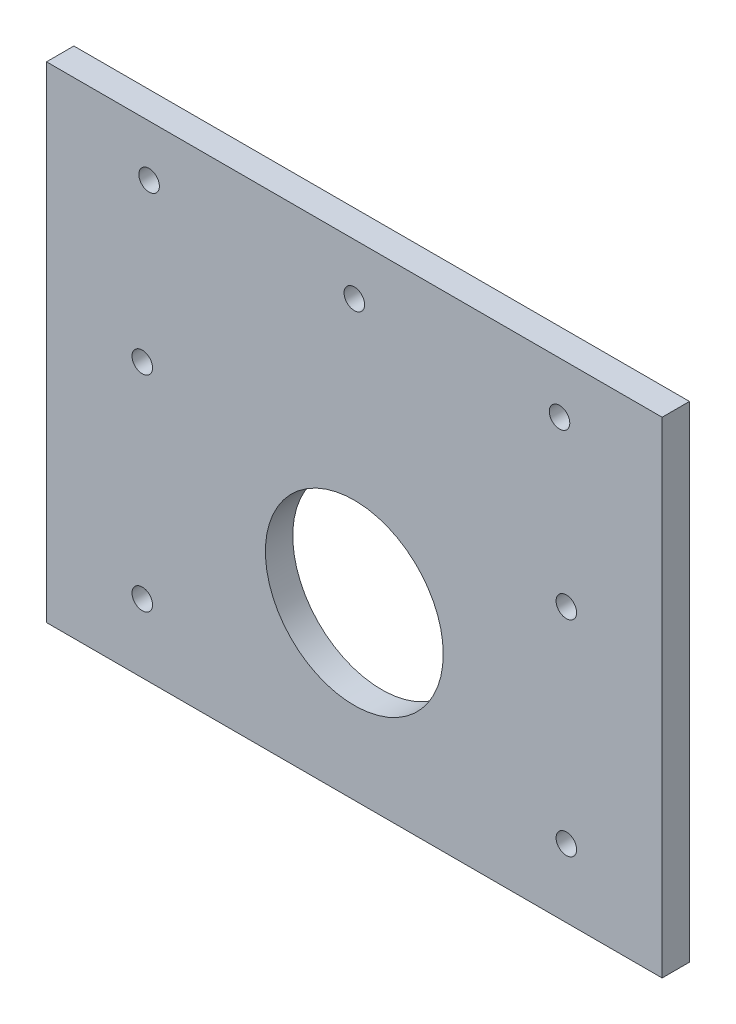
ISO-10303-21;
HEADER;
FILE_DESCRIPTION(('STEP AP214'),'2;1');
FILE_NAME('part.step','',(''),(''),'','','');
FILE_SCHEMA(('AUTOMOTIVE_DESIGN { 1 0 10303 214 1 1 1 1 }'));
ENDSEC;
DATA;
#1=APPLICATION_CONTEXT('core data for automotive mechanical design processes');
#2=APPLICATION_PROTOCOL_DEFINITION('international standard','automotive_design',2000,#1);
#3=PRODUCT_CONTEXT('',#1,'mechanical');
#4=PRODUCT('Part','Part','',(#3));
#5=PRODUCT_RELATED_PRODUCT_CATEGORY('part','',(#4));
#6=PRODUCT_DEFINITION_FORMATION('','',#4);
#7=PRODUCT_DEFINITION_CONTEXT('part definition',#1,'design');
#8=PRODUCT_DEFINITION('design','',#6,#7);
#9=PRODUCT_DEFINITION_SHAPE('','',#8);
#10=(LENGTH_UNIT() NAMED_UNIT(*) SI_UNIT(.MILLI.,.METRE.));
#11=(NAMED_UNIT(*) PLANE_ANGLE_UNIT() SI_UNIT($,.RADIAN.));
#12=(NAMED_UNIT(*) SI_UNIT($,.STERADIAN.) SOLID_ANGLE_UNIT());
#13=UNCERTAINTY_MEASURE_WITH_UNIT(LENGTH_MEASURE(1.E-05),#10,'distance_accuracy_value','');
#14=(GEOMETRIC_REPRESENTATION_CONTEXT(3) GLOBAL_UNCERTAINTY_ASSIGNED_CONTEXT((#13)) GLOBAL_UNIT_ASSIGNED_CONTEXT((#10,
#11,#12)) REPRESENTATION_CONTEXT('',''));
#15=CARTESIAN_POINT('',(0.,0.,0.));
#16=DIRECTION('',(0.,0.,1.));
#17=DIRECTION('',(1.,0.,0.));
#18=AXIS2_PLACEMENT_3D('',#15,#16,#17);
#19=CARTESIAN_POINT('',(45.,35.5,4.));
#20=DIRECTION('',(-1.,0.,0.));
#21=DIRECTION('',(0.,0.,1.));
#22=AXIS2_PLACEMENT_3D('',#19,#20,#21);
#23=PLANE('',#22);
#24=DIRECTION('',(0.,1.,0.));
#25=VECTOR('',#24,1.);
#26=CARTESIAN_POINT('',(45.,35.5,0.));
#27=LINE('',#26,#25);
#28=CARTESIAN_POINT('',(45.,-35.5,0.));
#29=VERTEX_POINT('',#28);
#30=CARTESIAN_POINT('',(45.,35.5,0.));
#31=VERTEX_POINT('',#30);
#32=EDGE_CURVE('E107',#29,#31,#27,.T.);
#33=ORIENTED_EDGE('',*,*,#32,.T.);
#34=DIRECTION('',(0.,0.,-1.));
#35=VECTOR('',#34,1.);
#36=CARTESIAN_POINT('',(45.,35.5,4.));
#37=LINE('',#36,#35);
#38=CARTESIAN_POINT('',(45.,35.5,4.));
#39=VERTEX_POINT('',#38);
#40=EDGE_CURVE('E11',#39,#31,#37,.T.);
#41=ORIENTED_EDGE('',*,*,#40,.F.);
#42=DIRECTION('',(0.,1.,0.));
#43=VECTOR('',#42,1.);
#44=CARTESIAN_POINT('',(45.,35.5,4.));
#45=LINE('',#44,#43);
#46=CARTESIAN_POINT('',(45.,-35.5,4.));
#47=VERTEX_POINT('',#46);
#48=EDGE_CURVE('E91',#47,#39,#45,.T.);
#49=ORIENTED_EDGE('',*,*,#48,.F.);
#50=DIRECTION('',(0.,0.,-1.));
#51=VECTOR('',#50,1.);
#52=CARTESIAN_POINT('',(45.,-35.5,4.));
#53=LINE('',#52,#51);
#54=EDGE_CURVE('E103',#47,#29,#53,.T.);
#55=ORIENTED_EDGE('',*,*,#54,.T.);
#56=EDGE_LOOP('',(#33,#41,#49,#55));
#57=FACE_BOUND('',#56,.T.);
#58=ADVANCED_FACE('F39',(#57),#23,.F.);
#59=CARTESIAN_POINT('',(-45.,35.5,4.));
#60=DIRECTION('',(0.,-1.,0.));
#61=DIRECTION('',(0.,0.,-1.));
#62=AXIS2_PLACEMENT_3D('',#59,#60,#61);
#63=PLANE('',#62);
#64=DIRECTION('',(-1.,0.,0.));
#65=VECTOR('',#64,1.);
#66=CARTESIAN_POINT('',(-45.,35.5,0.));
#67=LINE('',#66,#65);
#68=CARTESIAN_POINT('',(-45.,35.5,0.));
#69=VERTEX_POINT('',#68);
#70=EDGE_CURVE('E96',#31,#69,#67,.T.);
#71=ORIENTED_EDGE('',*,*,#70,.T.);
#72=DIRECTION('',(0.,0.,-1.));
#73=VECTOR('',#72,1.);
#74=CARTESIAN_POINT('',(-45.,35.5,4.));
#75=LINE('',#74,#73);
#76=CARTESIAN_POINT('',(-45.,35.5,4.));
#77=VERTEX_POINT('',#76);
#78=EDGE_CURVE('E48',#77,#69,#75,.T.);
#79=ORIENTED_EDGE('',*,*,#78,.F.);
#80=DIRECTION('',(-1.,0.,0.));
#81=VECTOR('',#80,1.);
#82=CARTESIAN_POINT('',(-45.,35.5,4.));
#83=LINE('',#82,#81);
#84=EDGE_CURVE('E86',#39,#77,#83,.T.);
#85=ORIENTED_EDGE('',*,*,#84,.F.);
#86=ORIENTED_EDGE('',*,*,#40,.T.);
#87=EDGE_LOOP('',(#71,#79,#85,#86));
#88=FACE_BOUND('',#87,.T.);
#89=ADVANCED_FACE('F95',(#88),#63,.F.);
#90=CARTESIAN_POINT('',(-45.,35.5,4.));
#91=DIRECTION('',(1.,0.,0.));
#92=DIRECTION('',(0.,1.,0.));
#93=AXIS2_PLACEMENT_3D('',#90,#91,#92);
#94=PLANE('',#93);
#95=DIRECTION('',(0.,-1.,0.));
#96=VECTOR('',#95,1.);
#97=CARTESIAN_POINT('',(-45.,35.5,0.));
#98=LINE('',#97,#96);
#99=CARTESIAN_POINT('',(-45.,-35.5,0.));
#100=VERTEX_POINT('',#99);
#101=EDGE_CURVE('E73',#69,#100,#98,.T.);
#102=ORIENTED_EDGE('',*,*,#101,.T.);
#103=DIRECTION('',(0.,0.,-1.));
#104=VECTOR('',#103,1.);
#105=CARTESIAN_POINT('',(-45.,-35.5,4.));
#106=LINE('',#105,#104);
#107=CARTESIAN_POINT('',(-45.,-35.5,4.));
#108=VERTEX_POINT('',#107);
#109=EDGE_CURVE('E98',#108,#100,#106,.T.);
#110=ORIENTED_EDGE('',*,*,#109,.F.);
#111=DIRECTION('',(0.,-1.,0.));
#112=VECTOR('',#111,1.);
#113=CARTESIAN_POINT('',(-45.,35.5,4.));
#114=LINE('',#113,#112);
#115=EDGE_CURVE('E89',#77,#108,#114,.T.);
#116=ORIENTED_EDGE('',*,*,#115,.F.);
#117=ORIENTED_EDGE('',*,*,#78,.T.);
#118=EDGE_LOOP('',(#102,#110,#116,#117));
#119=FACE_BOUND('',#118,.T.);
#120=ADVANCED_FACE('F99',(#119),#94,.F.);
#121=CARTESIAN_POINT('',(-45.,-35.5,4.));
#122=DIRECTION('',(0.,1.,0.));
#123=DIRECTION('',(0.,0.,1.));
#124=AXIS2_PLACEMENT_3D('',#121,#122,#123);
#125=PLANE('',#124);
#126=DIRECTION('',(1.,0.,0.));
#127=VECTOR('',#126,1.);
#128=CARTESIAN_POINT('',(-45.,-35.5,0.));
#129=LINE('',#128,#127);
#130=EDGE_CURVE('E79',#100,#29,#129,.T.);
#131=ORIENTED_EDGE('',*,*,#130,.T.);
#132=ORIENTED_EDGE('',*,*,#54,.F.);
#133=DIRECTION('',(1.,0.,0.));
#134=VECTOR('',#133,1.);
#135=CARTESIAN_POINT('',(-45.,-35.5,4.));
#136=LINE('',#135,#134);
#137=EDGE_CURVE('E56',#108,#47,#136,.T.);
#138=ORIENTED_EDGE('',*,*,#137,.F.);
#139=ORIENTED_EDGE('',*,*,#109,.T.);
#140=EDGE_LOOP('',(#131,#132,#138,#139));
#141=FACE_BOUND('',#140,.T.);
#142=ADVANCED_FACE('F121',(#141),#125,.F.);
#143=CARTESIAN_POINT('',(0.,0.,4.));
#144=DIRECTION('',(0.,0.,1.));
#145=DIRECTION('',(1.,0.,0.));
#146=AXIS2_PLACEMENT_3D('',#143,#144,#145);
#147=PLANE('',#146);
#148=CARTESIAN_POINT('',(31.,4.50000000000001,4.));
#149=DIRECTION('',(0.,0.,1.));
#150=DIRECTION('',(1.,0.,0.));
#151=AXIS2_PLACEMENT_3D('',#148,#149,#150);
#152=CIRCLE('',#151,1.5);
#153=CARTESIAN_POINT('',(32.5,4.50000000000001,4.));
#154=VERTEX_POINT('',#153);
#155=EDGE_CURVE('E160',#154,#154,#152,.T.);
#156=ORIENTED_EDGE('',*,*,#155,.F.);
#157=EDGE_LOOP('',(#156));
#158=FACE_BOUND('',#157,.T.);
#159=CARTESIAN_POINT('',(31.,-25.5,4.));
#160=DIRECTION('',(0.,0.,1.));
#161=DIRECTION('',(1.,0.,0.));
#162=AXIS2_PLACEMENT_3D('',#159,#160,#161);
#163=CIRCLE('',#162,1.5);
#164=CARTESIAN_POINT('',(32.5,-25.5,4.));
#165=VERTEX_POINT('',#164);
#166=EDGE_CURVE('E168',#165,#165,#163,.T.);
#167=ORIENTED_EDGE('',*,*,#166,.F.);
#168=EDGE_LOOP('',(#167));
#169=FACE_BOUND('',#168,.T.);
#170=CARTESIAN_POINT('',(-31.,-25.5,4.));
#171=DIRECTION('',(0.,0.,1.));
#172=DIRECTION('',(1.,0.,0.));
#173=AXIS2_PLACEMENT_3D('',#170,#171,#172);
#174=CIRCLE('',#173,1.5);
#175=CARTESIAN_POINT('',(-29.5,-25.5,4.));
#176=VERTEX_POINT('',#175);
#177=EDGE_CURVE('E176',#176,#176,#174,.T.);
#178=ORIENTED_EDGE('',*,*,#177,.F.);
#179=EDGE_LOOP('',(#178));
#180=FACE_BOUND('',#179,.T.);
#181=CARTESIAN_POINT('',(-31.,4.50000000000001,4.));
#182=DIRECTION('',(0.,0.,1.));
#183=DIRECTION('',(1.,0.,0.));
#184=AXIS2_PLACEMENT_3D('',#181,#182,#183);
#185=CIRCLE('',#184,1.5);
#186=CARTESIAN_POINT('',(-29.5,4.50000000000001,4.));
#187=VERTEX_POINT('',#186);
#188=EDGE_CURVE('E184',#187,#187,#185,.T.);
#189=ORIENTED_EDGE('',*,*,#188,.F.);
#190=EDGE_LOOP('',(#189));
#191=FACE_BOUND('',#190,.T.);
#192=CARTESIAN_POINT('',(0.,-10.5,4.));
#193=DIRECTION('',(0.,0.,1.));
#194=DIRECTION('',(1.,0.,0.));
#195=AXIS2_PLACEMENT_3D('',#192,#193,#194);
#196=CIRCLE('',#195,13.);
#197=CARTESIAN_POINT('',(13.,-10.5,4.));
#198=VERTEX_POINT('',#197);
#199=EDGE_CURVE('E152',#198,#198,#196,.T.);
#200=ORIENTED_EDGE('',*,*,#199,.F.);
#201=EDGE_LOOP('',(#200));
#202=FACE_BOUND('',#201,.T.);
#203=CARTESIAN_POINT('',(30.,28.,4.));
#204=DIRECTION('',(0.,0.,1.));
#205=DIRECTION('',(-1.,0.,0.));
#206=AXIS2_PLACEMENT_3D('',#203,#204,#205);
#207=CIRCLE('',#206,1.5);
#208=CARTESIAN_POINT('',(28.5,28.,4.));
#209=VERTEX_POINT('',#208);
#210=EDGE_CURVE('E136',#209,#209,#207,.T.);
#211=ORIENTED_EDGE('',*,*,#210,.F.);
#212=EDGE_LOOP('',(#211));
#213=FACE_BOUND('',#212,.T.);
#214=CARTESIAN_POINT('',(-30.,28.,4.));
#215=DIRECTION('',(0.,0.,1.));
#216=DIRECTION('',(1.,0.,0.));
#217=AXIS2_PLACEMENT_3D('',#214,#215,#216);
#218=CIRCLE('',#217,1.5);
#219=CARTESIAN_POINT('',(-28.5,28.,4.));
#220=VERTEX_POINT('',#219);
#221=EDGE_CURVE('E145',#220,#220,#218,.T.);
#222=ORIENTED_EDGE('',*,*,#221,.F.);
#223=EDGE_LOOP('',(#222));
#224=FACE_BOUND('',#223,.T.);
#225=CARTESIAN_POINT('',(0.,28.,4.));
#226=DIRECTION('',(0.,0.,1.));
#227=DIRECTION('',(1.,0.,0.));
#228=AXIS2_PLACEMENT_3D('',#225,#226,#227);
#229=CIRCLE('',#228,1.5);
#230=CARTESIAN_POINT('',(1.5,28.,4.));
#231=VERTEX_POINT('',#230);
#232=EDGE_CURVE('E128',#231,#231,#229,.T.);
#233=ORIENTED_EDGE('',*,*,#232,.F.);
#234=EDGE_LOOP('',(#233));
#235=FACE_BOUND('',#234,.T.);
#236=ORIENTED_EDGE('',*,*,#48,.T.);
#237=ORIENTED_EDGE('',*,*,#84,.T.);
#238=ORIENTED_EDGE('',*,*,#115,.T.);
#239=ORIENTED_EDGE('',*,*,#137,.T.);
#240=EDGE_LOOP('',(#236,#237,#238,#239));
#241=FACE_BOUND('',#240,.T.);
#242=ADVANCED_FACE('F87',(#158,#169,#180,#191,#202,#213,#224,#235,#241),#147,.T.);
#243=CARTESIAN_POINT('',(0.,0.,0.));
#244=DIRECTION('',(0.,0.,1.));
#245=DIRECTION('',(1.,0.,0.));
#246=AXIS2_PLACEMENT_3D('',#243,#244,#245);
#247=PLANE('',#246);
#248=CARTESIAN_POINT('',(31.,4.50000000000001,0.));
#249=DIRECTION('',(0.,0.,1.));
#250=DIRECTION('',(1.,0.,0.));
#251=AXIS2_PLACEMENT_3D('',#248,#249,#250);
#252=CIRCLE('',#251,1.5);
#253=CARTESIAN_POINT('',(32.5,4.50000000000001,0.));
#254=VERTEX_POINT('',#253);
#255=EDGE_CURVE('E164',#254,#254,#252,.T.);
#256=ORIENTED_EDGE('',*,*,#255,.T.);
#257=EDGE_LOOP('',(#256));
#258=FACE_BOUND('',#257,.T.);
#259=CARTESIAN_POINT('',(31.,-25.5,0.));
#260=DIRECTION('',(0.,0.,1.));
#261=DIRECTION('',(1.,0.,0.));
#262=AXIS2_PLACEMENT_3D('',#259,#260,#261);
#263=CIRCLE('',#262,1.5);
#264=CARTESIAN_POINT('',(32.5,-25.5,0.));
#265=VERTEX_POINT('',#264);
#266=EDGE_CURVE('E172',#265,#265,#263,.T.);
#267=ORIENTED_EDGE('',*,*,#266,.T.);
#268=EDGE_LOOP('',(#267));
#269=FACE_BOUND('',#268,.T.);
#270=CARTESIAN_POINT('',(-31.,-25.5,0.));
#271=DIRECTION('',(0.,0.,1.));
#272=DIRECTION('',(1.,0.,0.));
#273=AXIS2_PLACEMENT_3D('',#270,#271,#272);
#274=CIRCLE('',#273,1.5);
#275=CARTESIAN_POINT('',(-29.5,-25.5,0.));
#276=VERTEX_POINT('',#275);
#277=EDGE_CURVE('E180',#276,#276,#274,.T.);
#278=ORIENTED_EDGE('',*,*,#277,.T.);
#279=EDGE_LOOP('',(#278));
#280=FACE_BOUND('',#279,.T.);
#281=CARTESIAN_POINT('',(-31.,4.50000000000001,0.));
#282=DIRECTION('',(0.,0.,1.));
#283=DIRECTION('',(1.,0.,0.));
#284=AXIS2_PLACEMENT_3D('',#281,#282,#283);
#285=CIRCLE('',#284,1.5);
#286=CARTESIAN_POINT('',(-29.5,4.50000000000001,0.));
#287=VERTEX_POINT('',#286);
#288=EDGE_CURVE('E156',#287,#287,#285,.T.);
#289=ORIENTED_EDGE('',*,*,#288,.T.);
#290=EDGE_LOOP('',(#289));
#291=FACE_BOUND('',#290,.T.);
#292=CARTESIAN_POINT('',(0.,-10.5,0.));
#293=DIRECTION('',(0.,0.,1.));
#294=DIRECTION('',(1.,0.,0.));
#295=AXIS2_PLACEMENT_3D('',#292,#293,#294);
#296=CIRCLE('',#295,13.);
#297=CARTESIAN_POINT('',(13.,-10.5,0.));
#298=VERTEX_POINT('',#297);
#299=EDGE_CURVE('E141',#298,#298,#296,.T.);
#300=ORIENTED_EDGE('',*,*,#299,.T.);
#301=EDGE_LOOP('',(#300));
#302=FACE_BOUND('',#301,.T.);
#303=CARTESIAN_POINT('',(30.,28.,0.));
#304=DIRECTION('',(0.,0.,1.));
#305=DIRECTION('',(-1.,0.,0.));
#306=AXIS2_PLACEMENT_3D('',#303,#304,#305);
#307=CIRCLE('',#306,1.5);
#308=CARTESIAN_POINT('',(28.5,28.,0.));
#309=VERTEX_POINT('',#308);
#310=EDGE_CURVE('E140',#309,#309,#307,.T.);
#311=ORIENTED_EDGE('',*,*,#310,.T.);
#312=EDGE_LOOP('',(#311));
#313=FACE_BOUND('',#312,.T.);
#314=CARTESIAN_POINT('',(-30.,28.,0.));
#315=DIRECTION('',(0.,0.,1.));
#316=DIRECTION('',(1.,0.,0.));
#317=AXIS2_PLACEMENT_3D('',#314,#315,#316);
#318=CIRCLE('',#317,1.5);
#319=CARTESIAN_POINT('',(-28.5,28.,0.));
#320=VERTEX_POINT('',#319);
#321=EDGE_CURVE('E132',#320,#320,#318,.T.);
#322=ORIENTED_EDGE('',*,*,#321,.T.);
#323=EDGE_LOOP('',(#322));
#324=FACE_BOUND('',#323,.T.);
#325=CARTESIAN_POINT('',(0.,28.,0.));
#326=DIRECTION('',(0.,0.,1.));
#327=DIRECTION('',(1.,0.,0.));
#328=AXIS2_PLACEMENT_3D('',#325,#326,#327);
#329=CIRCLE('',#328,1.5);
#330=CARTESIAN_POINT('',(1.5,28.,0.));
#331=VERTEX_POINT('',#330);
#332=EDGE_CURVE('E111',#331,#331,#329,.T.);
#333=ORIENTED_EDGE('',*,*,#332,.T.);
#334=EDGE_LOOP('',(#333));
#335=FACE_BOUND('',#334,.T.);
#336=ORIENTED_EDGE('',*,*,#32,.F.);
#337=ORIENTED_EDGE('',*,*,#130,.F.);
#338=ORIENTED_EDGE('',*,*,#101,.F.);
#339=ORIENTED_EDGE('',*,*,#70,.F.);
#340=EDGE_LOOP('',(#336,#337,#338,#339));
#341=FACE_BOUND('',#340,.T.);
#342=ADVANCED_FACE('F124',(#258,#269,#280,#291,#302,#313,#324,#335,#341),#247,.F.);
#343=CARTESIAN_POINT('',(0.,28.,0.));
#344=DIRECTION('',(0.,0.,1.));
#345=DIRECTION('',(1.,0.,0.));
#346=AXIS2_PLACEMENT_3D('',#343,#344,#345);
#347=CYLINDRICAL_SURFACE('',#346,1.5);
#348=ORIENTED_EDGE('',*,*,#332,.F.);
#349=EDGE_LOOP('',(#348));
#350=FACE_BOUND('',#349,.T.);
#351=ORIENTED_EDGE('',*,*,#232,.T.);
#352=EDGE_LOOP('',(#351));
#353=FACE_BOUND('',#352,.T.);
#354=ADVANCED_FACE('F214',(#350,#353),#347,.F.);
#355=CARTESIAN_POINT('',(-30.,28.,0.));
#356=DIRECTION('',(0.,0.,1.));
#357=DIRECTION('',(1.,0.,0.));
#358=AXIS2_PLACEMENT_3D('',#355,#356,#357);
#359=CYLINDRICAL_SURFACE('',#358,1.5);
#360=ORIENTED_EDGE('',*,*,#321,.F.);
#361=EDGE_LOOP('',(#360));
#362=FACE_BOUND('',#361,.T.);
#363=ORIENTED_EDGE('',*,*,#221,.T.);
#364=EDGE_LOOP('',(#363));
#365=FACE_BOUND('',#364,.T.);
#366=ADVANCED_FACE('F216',(#362,#365),#359,.F.);
#367=CARTESIAN_POINT('',(30.,28.,0.));
#368=DIRECTION('',(0.,0.,1.));
#369=DIRECTION('',(1.,0.,0.));
#370=AXIS2_PLACEMENT_3D('',#367,#368,#369);
#371=CYLINDRICAL_SURFACE('',#370,1.5);
#372=ORIENTED_EDGE('',*,*,#310,.F.);
#373=EDGE_LOOP('',(#372));
#374=FACE_BOUND('',#373,.T.);
#375=ORIENTED_EDGE('',*,*,#210,.T.);
#376=EDGE_LOOP('',(#375));
#377=FACE_BOUND('',#376,.T.);
#378=ADVANCED_FACE('F223',(#374,#377),#371,.F.);
#379=CARTESIAN_POINT('',(0.,-10.5,0.));
#380=DIRECTION('',(0.,0.,1.));
#381=DIRECTION('',(1.,0.,0.));
#382=AXIS2_PLACEMENT_3D('',#379,#380,#381);
#383=CYLINDRICAL_SURFACE('',#382,13.);
#384=ORIENTED_EDGE('',*,*,#299,.F.);
#385=EDGE_LOOP('',(#384));
#386=FACE_BOUND('',#385,.T.);
#387=ORIENTED_EDGE('',*,*,#199,.T.);
#388=EDGE_LOOP('',(#387));
#389=FACE_BOUND('',#388,.T.);
#390=ADVANCED_FACE('F198',(#386,#389),#383,.F.);
#391=CARTESIAN_POINT('',(-31.,4.50000000000001,0.));
#392=DIRECTION('',(0.,0.,1.));
#393=DIRECTION('',(1.,0.,0.));
#394=AXIS2_PLACEMENT_3D('',#391,#392,#393);
#395=CYLINDRICAL_SURFACE('',#394,1.5);
#396=ORIENTED_EDGE('',*,*,#288,.F.);
#397=EDGE_LOOP('',(#396));
#398=FACE_BOUND('',#397,.T.);
#399=ORIENTED_EDGE('',*,*,#188,.T.);
#400=EDGE_LOOP('',(#399));
#401=FACE_BOUND('',#400,.T.);
#402=ADVANCED_FACE('F194',(#398,#401),#395,.F.);
#403=CARTESIAN_POINT('',(-31.,-25.5,0.));
#404=DIRECTION('',(0.,0.,1.));
#405=DIRECTION('',(1.,0.,0.));
#406=AXIS2_PLACEMENT_3D('',#403,#404,#405);
#407=CYLINDRICAL_SURFACE('',#406,1.5);
#408=ORIENTED_EDGE('',*,*,#277,.F.);
#409=EDGE_LOOP('',(#408));
#410=FACE_BOUND('',#409,.T.);
#411=ORIENTED_EDGE('',*,*,#177,.T.);
#412=EDGE_LOOP('',(#411));
#413=FACE_BOUND('',#412,.T.);
#414=ADVANCED_FACE('F197',(#410,#413),#407,.F.);
#415=CARTESIAN_POINT('',(31.,-25.5,0.));
#416=DIRECTION('',(0.,0.,1.));
#417=DIRECTION('',(1.,0.,0.));
#418=AXIS2_PLACEMENT_3D('',#415,#416,#417);
#419=CYLINDRICAL_SURFACE('',#418,1.5);
#420=ORIENTED_EDGE('',*,*,#266,.F.);
#421=EDGE_LOOP('',(#420));
#422=FACE_BOUND('',#421,.T.);
#423=ORIENTED_EDGE('',*,*,#166,.T.);
#424=EDGE_LOOP('',(#423));
#425=FACE_BOUND('',#424,.T.);
#426=ADVANCED_FACE('F280',(#422,#425),#419,.F.);
#427=CARTESIAN_POINT('',(31.,4.50000000000001,0.));
#428=DIRECTION('',(0.,0.,1.));
#429=DIRECTION('',(1.,0.,0.));
#430=AXIS2_PLACEMENT_3D('',#427,#428,#429);
#431=CYLINDRICAL_SURFACE('',#430,1.5);
#432=ORIENTED_EDGE('',*,*,#255,.F.);
#433=EDGE_LOOP('',(#432));
#434=FACE_BOUND('',#433,.T.);
#435=ORIENTED_EDGE('',*,*,#155,.T.);
#436=EDGE_LOOP('',(#435));
#437=FACE_BOUND('',#436,.T.);
#438=ADVANCED_FACE('F290',(#434,#437),#431,.F.);
#439=CLOSED_SHELL('',(#58,#89,#120,#142,#242,#342,#354,#366,#378,#390,#402,#414,#426,#438));
#440=MANIFOLD_SOLID_BREP('B2',#439);
#441=ADVANCED_BREP_SHAPE_REPRESENTATION('',(#18,#440),#14);
#442=SHAPE_DEFINITION_REPRESENTATION(#9,#441);
ENDSEC;
END-ISO-10303-21;
